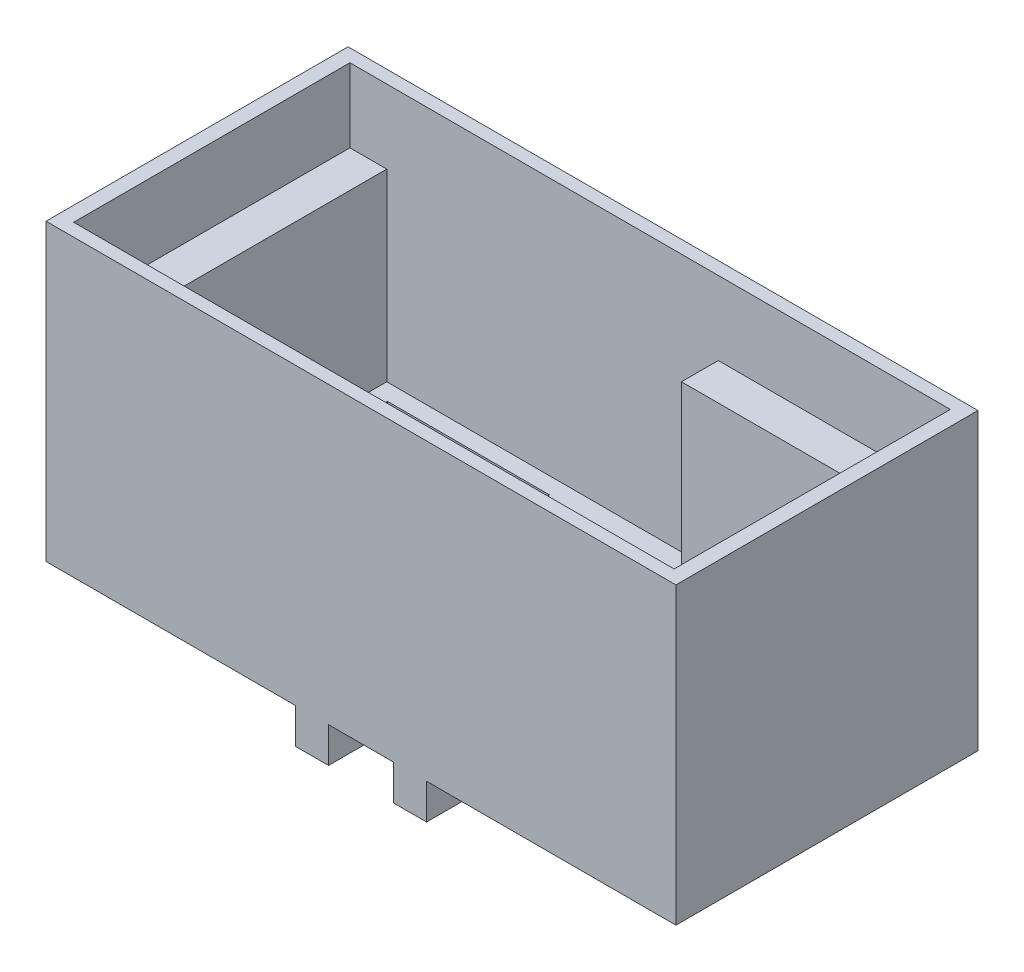
ISO-10303-21;
HEADER;
FILE_DESCRIPTION(('STEP AP214'),'2;1');
FILE_NAME('part.step','',(''),(''),'','','');
FILE_SCHEMA(('AUTOMOTIVE_DESIGN { 1 0 10303 214 1 1 1 1 }'));
ENDSEC;
DATA;
#1=APPLICATION_CONTEXT('core data for automotive mechanical design processes');
#2=APPLICATION_PROTOCOL_DEFINITION('international standard','automotive_design',2000,#1);
#3=PRODUCT_CONTEXT('',#1,'mechanical');
#4=PRODUCT('Part','Part','',(#3));
#5=PRODUCT_RELATED_PRODUCT_CATEGORY('part','',(#4));
#6=PRODUCT_DEFINITION_FORMATION('','',#4);
#7=PRODUCT_DEFINITION_CONTEXT('part definition',#1,'design');
#8=PRODUCT_DEFINITION('design','',#6,#7);
#9=PRODUCT_DEFINITION_SHAPE('','',#8);
#10=(LENGTH_UNIT() NAMED_UNIT(*) SI_UNIT(.MILLI.,.METRE.));
#11=(NAMED_UNIT(*) PLANE_ANGLE_UNIT() SI_UNIT($,.RADIAN.));
#12=(NAMED_UNIT(*) SI_UNIT($,.STERADIAN.) SOLID_ANGLE_UNIT());
#13=UNCERTAINTY_MEASURE_WITH_UNIT(LENGTH_MEASURE(1.E-05),#10,'distance_accuracy_value','');
#14=(GEOMETRIC_REPRESENTATION_CONTEXT(3) GLOBAL_UNCERTAINTY_ASSIGNED_CONTEXT((#13)) GLOBAL_UNIT_ASSIGNED_CONTEXT((#10,
#11,#12)) REPRESENTATION_CONTEXT('',''));
#15=CARTESIAN_POINT('',(0.,0.,0.));
#16=DIRECTION('',(0.,0.,1.));
#17=DIRECTION('',(1.,0.,0.));
#18=AXIS2_PLACEMENT_3D('',#15,#16,#17);
#19=CARTESIAN_POINT('',(0.,30.,0.));
#20=DIRECTION('',(0.,-1.,0.));
#21=DIRECTION('',(0.,0.,-1.));
#22=AXIS2_PLACEMENT_3D('',#19,#20,#21);
#23=PLANE('',#22);
#24=DIRECTION('',(0.,0.,-1.));
#25=VECTOR('',#24,1.);
#26=CARTESIAN_POINT('',(9.25,30.,-18.75));
#27=LINE('',#26,#25);
#28=CARTESIAN_POINT('',(9.25,30.,-13.75));
#29=VERTEX_POINT('',#28);
#30=CARTESIAN_POINT('',(9.25,30.,-18.75));
#31=VERTEX_POINT('',#30);
#32=EDGE_CURVE('E333',#29,#31,#27,.T.);
#33=ORIENTED_EDGE('',*,*,#32,.F.);
#34=DIRECTION('',(-1.,0.,0.));
#35=VECTOR('',#34,1.);
#36=CARTESIAN_POINT('',(-35.75,30.,-13.75));
#37=LINE('',#36,#35);
#38=CARTESIAN_POINT('',(35.75,30.,-13.75));
#39=VERTEX_POINT('',#38);
#40=EDGE_CURVE('E319',#39,#29,#37,.T.);
#41=ORIENTED_EDGE('',*,*,#40,.F.);
#42=DIRECTION('',(0.,0.,-1.));
#43=VECTOR('',#42,1.);
#44=CARTESIAN_POINT('',(35.75,30.,18.75));
#45=LINE('',#44,#43);
#46=CARTESIAN_POINT('',(35.75,30.,18.75));
#47=VERTEX_POINT('',#46);
#48=EDGE_CURVE('E342',#47,#39,#45,.T.);
#49=ORIENTED_EDGE('',*,*,#48,.F.);
#50=DIRECTION('',(1.,0.,0.));
#51=VECTOR('',#50,1.);
#52=CARTESIAN_POINT('',(-40.75,30.,18.75));
#53=LINE('',#52,#51);
#54=CARTESIAN_POINT('',(40.75,30.,18.75));
#55=VERTEX_POINT('',#54);
#56=EDGE_CURVE('E381',#47,#55,#53,.T.);
#57=ORIENTED_EDGE('',*,*,#56,.T.);
#58=DIRECTION('',(0.,0.,-1.));
#59=VECTOR('',#58,1.);
#60=CARTESIAN_POINT('',(40.75,30.,18.75));
#61=LINE('',#60,#59);
#62=CARTESIAN_POINT('',(40.75,30.,-18.75));
#63=VERTEX_POINT('',#62);
#64=EDGE_CURVE('E370',#55,#63,#61,.T.);
#65=ORIENTED_EDGE('',*,*,#64,.T.);
#66=DIRECTION('',(-1.,0.,0.));
#67=VECTOR('',#66,1.);
#68=CARTESIAN_POINT('',(-40.75,30.,-18.75));
#69=LINE('',#68,#67);
#70=EDGE_CURVE('E375',#63,#31,#69,.T.);
#71=ORIENTED_EDGE('',*,*,#70,.T.);
#72=EDGE_LOOP('',(#33,#41,#49,#57,#65,#71));
#73=FACE_BOUND('',#72,.T.);
#74=ADVANCED_FACE('F37',(#73),#23,.F.);
#75=DIRECTION('',(1.,0.,0.));
#76=VECTOR('',#75,1.);
#77=CARTESIAN_POINT('',(-35.75,30.,13.75));
#78=LINE('',#77,#76);
#79=CARTESIAN_POINT('',(-35.75,30.,13.75));
#80=VERTEX_POINT('',#79);
#81=CARTESIAN_POINT('',(-9.24999999999999,30.,13.75));
#82=VERTEX_POINT('',#81);
#83=EDGE_CURVE('E253',#80,#82,#78,.T.);
#84=ORIENTED_EDGE('',*,*,#83,.F.);
#85=DIRECTION('',(0.,0.,1.));
#86=VECTOR('',#85,1.);
#87=CARTESIAN_POINT('',(-35.75,30.,-18.75));
#88=LINE('',#87,#86);
#89=CARTESIAN_POINT('',(-35.75,30.,-18.75));
#90=VERTEX_POINT('',#89);
#91=EDGE_CURVE('E340',#90,#80,#88,.T.);
#92=ORIENTED_EDGE('',*,*,#91,.F.);
#93=CARTESIAN_POINT('',(-40.75,30.,-18.75));
#94=VERTEX_POINT('',#93);
#95=EDGE_CURVE('E373',#90,#94,#69,.T.);
#96=ORIENTED_EDGE('',*,*,#95,.T.);
#97=DIRECTION('',(0.,0.,1.));
#98=VECTOR('',#97,1.);
#99=CARTESIAN_POINT('',(-40.75,30.,18.75));
#100=LINE('',#99,#98);
#101=CARTESIAN_POINT('',(-40.75,30.,18.75));
#102=VERTEX_POINT('',#101);
#103=EDGE_CURVE('E378',#94,#102,#100,.T.);
#104=ORIENTED_EDGE('',*,*,#103,.T.);
#105=CARTESIAN_POINT('',(-9.24999999999999,30.,18.75));
#106=VERTEX_POINT('',#105);
#107=EDGE_CURVE('E382',#102,#106,#53,.T.);
#108=ORIENTED_EDGE('',*,*,#107,.T.);
#109=DIRECTION('',(0.,0.,1.));
#110=VECTOR('',#109,1.);
#111=CARTESIAN_POINT('',(-9.24999999999999,30.,18.75));
#112=LINE('',#111,#110);
#113=EDGE_CURVE('E359',#82,#106,#112,.T.);
#114=ORIENTED_EDGE('',*,*,#113,.F.);
#115=EDGE_LOOP('',(#84,#92,#96,#104,#108,#114));
#116=FACE_BOUND('',#115,.T.);
#117=ADVANCED_FACE('F541',(#116),#23,.F.);
#118=CARTESIAN_POINT('',(0.,0.,0.));
#119=DIRECTION('',(0.,-1.,0.));
#120=DIRECTION('',(0.,0.,-1.));
#121=AXIS2_PLACEMENT_3D('',#118,#119,#120);
#122=PLANE('',#121);
#123=DIRECTION('',(-1.,0.,0.));
#124=VECTOR('',#123,1.);
#125=CARTESIAN_POINT('',(-42.75,0.,-20.5));
#126=LINE('',#125,#124);
#127=CARTESIAN_POINT('',(4.39999999999999,0.,-20.5));
#128=VERTEX_POINT('',#127);
#129=CARTESIAN_POINT('',(-4.40000000000002,0.,-20.5));
#130=VERTEX_POINT('',#129);
#131=EDGE_CURVE('E472',#128,#130,#126,.T.);
#132=ORIENTED_EDGE('',*,*,#131,.F.);
#133=DIRECTION('',(0.,0.,-1.));
#134=VECTOR('',#133,1.);
#135=CARTESIAN_POINT('',(4.39999999999999,0.,20.5));
#136=LINE('',#135,#134);
#137=CARTESIAN_POINT('',(4.39999999999999,0.,20.5));
#138=VERTEX_POINT('',#137);
#139=EDGE_CURVE('E415',#138,#128,#136,.T.);
#140=ORIENTED_EDGE('',*,*,#139,.F.);
#141=DIRECTION('',(1.,0.,0.));
#142=VECTOR('',#141,1.);
#143=CARTESIAN_POINT('',(-42.75,0.,20.5));
#144=LINE('',#143,#142);
#145=CARTESIAN_POINT('',(-4.40000000000002,0.,20.5));
#146=VERTEX_POINT('',#145);
#147=EDGE_CURVE('E477',#146,#138,#144,.T.);
#148=ORIENTED_EDGE('',*,*,#147,.F.);
#149=DIRECTION('',(0.,0.,1.));
#150=VECTOR('',#149,1.);
#151=CARTESIAN_POINT('',(-4.40000000000001,0.,20.5));
#152=LINE('',#151,#150);
#153=EDGE_CURVE('E419',#130,#146,#152,.T.);
#154=ORIENTED_EDGE('',*,*,#153,.F.);
#155=EDGE_LOOP('',(#132,#140,#148,#154));
#156=FACE_BOUND('',#155,.T.);
#157=ADVANCED_FACE('F512',(#156),#122,.T.);
#158=DIRECTION('',(0.,0.,-1.));
#159=VECTOR('',#158,1.);
#160=CARTESIAN_POINT('',(33.4125,0.,16.5));
#161=LINE('',#160,#159);
#162=CARTESIAN_POINT('',(33.4125,0.,16.5));
#163=VERTEX_POINT('',#162);
#164=CARTESIAN_POINT('',(33.4125,0.,-11.5));
#165=VERTEX_POINT('',#164);
#166=EDGE_CURVE('E306',#163,#165,#161,.T.);
#167=ORIENTED_EDGE('',*,*,#166,.T.);
#168=DIRECTION('',(-1.,0.,0.));
#169=VECTOR('',#168,1.);
#170=CARTESIAN_POINT('',(11.4125,0.,-11.5));
#171=LINE('',#170,#169);
#172=CARTESIAN_POINT('',(11.4125,0.,-11.5));
#173=VERTEX_POINT('',#172);
#174=EDGE_CURVE('E285',#165,#173,#171,.T.);
#175=ORIENTED_EDGE('',*,*,#174,.T.);
#176=DIRECTION('',(0.,0.,1.));
#177=VECTOR('',#176,1.);
#178=CARTESIAN_POINT('',(11.4125,0.,16.5));
#179=LINE('',#178,#177);
#180=CARTESIAN_POINT('',(11.4125,0.,16.5));
#181=VERTEX_POINT('',#180);
#182=EDGE_CURVE('E312',#173,#181,#179,.T.);
#183=ORIENTED_EDGE('',*,*,#182,.T.);
#184=DIRECTION('',(1.,0.,0.));
#185=VECTOR('',#184,1.);
#186=CARTESIAN_POINT('',(11.4125,0.,16.5));
#187=LINE('',#186,#185);
#188=EDGE_CURVE('E309',#181,#163,#187,.T.);
#189=ORIENTED_EDGE('',*,*,#188,.T.);
#190=EDGE_LOOP('',(#167,#175,#183,#189));
#191=FACE_BOUND('',#190,.T.);
#192=CARTESIAN_POINT('',(8.89999999999998,0.,20.5));
#193=VERTEX_POINT('',#192);
#194=CARTESIAN_POINT('',(42.75,0.,20.5));
#195=VERTEX_POINT('',#194);
#196=EDGE_CURVE('E474',#193,#195,#144,.T.);
#197=ORIENTED_EDGE('',*,*,#196,.F.);
#198=DIRECTION('',(0.,0.,1.));
#199=VECTOR('',#198,1.);
#200=CARTESIAN_POINT('',(8.9,0.,20.5));
#201=LINE('',#200,#199);
#202=CARTESIAN_POINT('',(8.9,0.,-20.5));
#203=VERTEX_POINT('',#202);
#204=EDGE_CURVE('E412',#203,#193,#201,.T.);
#205=ORIENTED_EDGE('',*,*,#204,.F.);
#206=CARTESIAN_POINT('',(42.75,0.,-20.5));
#207=VERTEX_POINT('',#206);
#208=EDGE_CURVE('E468',#207,#203,#126,.T.);
#209=ORIENTED_EDGE('',*,*,#208,.F.);
#210=DIRECTION('',(0.,0.,-1.));
#211=VECTOR('',#210,1.);
#212=CARTESIAN_POINT('',(42.75,0.,20.5));
#213=LINE('',#212,#211);
#214=EDGE_CURVE('E453',#195,#207,#213,.T.);
#215=ORIENTED_EDGE('',*,*,#214,.F.);
#216=EDGE_LOOP('',(#197,#205,#209,#215));
#217=FACE_BOUND('',#216,.T.);
#218=ADVANCED_FACE('F524',(#191,#217),#122,.T.);
#219=CARTESIAN_POINT('',(42.75,40.,20.5));
#220=DIRECTION('',(-1.,0.,0.));
#221=DIRECTION('',(0.,0.,1.));
#222=AXIS2_PLACEMENT_3D('',#219,#220,#221);
#223=PLANE('',#222);
#224=ORIENTED_EDGE('',*,*,#214,.T.);
#225=DIRECTION('',(0.,-1.,0.));
#226=VECTOR('',#225,1.);
#227=CARTESIAN_POINT('',(42.75,40.,-20.5));
#228=LINE('',#227,#226);
#229=CARTESIAN_POINT('',(42.75,40.,-20.5));
#230=VERTEX_POINT('',#229);
#231=EDGE_CURVE('E11',#230,#207,#228,.T.);
#232=ORIENTED_EDGE('',*,*,#231,.F.);
#233=DIRECTION('',(0.,0.,-1.));
#234=VECTOR('',#233,1.);
#235=CARTESIAN_POINT('',(42.75,40.,20.5));
#236=LINE('',#235,#234);
#237=CARTESIAN_POINT('',(42.75,40.,20.5));
#238=VERTEX_POINT('',#237);
#239=EDGE_CURVE('E454',#238,#230,#236,.T.);
#240=ORIENTED_EDGE('',*,*,#239,.F.);
#241=DIRECTION('',(0.,-1.,0.));
#242=VECTOR('',#241,1.);
#243=CARTESIAN_POINT('',(42.75,40.,20.5));
#244=LINE('',#243,#242);
#245=EDGE_CURVE('E464',#238,#195,#244,.T.);
#246=ORIENTED_EDGE('',*,*,#245,.T.);
#247=EDGE_LOOP('',(#224,#232,#240,#246));
#248=FACE_BOUND('',#247,.T.);
#249=ADVANCED_FACE('F39',(#248),#223,.F.);
#250=CARTESIAN_POINT('',(-42.75,40.,-20.5));
#251=DIRECTION('',(0.,0.,1.));
#252=DIRECTION('',(1.,0.,0.));
#253=AXIS2_PLACEMENT_3D('',#250,#251,#252);
#254=PLANE('',#253);
#255=ORIENTED_EDGE('',*,*,#208,.T.);
#256=DIRECTION('',(0.,1.,0.));
#257=VECTOR('',#256,1.);
#258=CARTESIAN_POINT('',(8.9,-4.8,-20.5));
#259=LINE('',#258,#257);
#260=CARTESIAN_POINT('',(8.9,-4.8,-20.5));
#261=VERTEX_POINT('',#260);
#262=EDGE_CURVE('E405',#261,#203,#259,.T.);
#263=ORIENTED_EDGE('',*,*,#262,.F.);
#264=DIRECTION('',(1.,0.,0.));
#265=VECTOR('',#264,1.);
#266=CARTESIAN_POINT('',(4.39999999999999,-4.8,-20.5));
#267=LINE('',#266,#265);
#268=CARTESIAN_POINT('',(4.39999999999999,-4.8,-20.5));
#269=VERTEX_POINT('',#268);
#270=EDGE_CURVE('E423',#269,#261,#267,.T.);
#271=ORIENTED_EDGE('',*,*,#270,.F.);
#272=DIRECTION('',(0.,1.,0.));
#273=VECTOR('',#272,1.);
#274=CARTESIAN_POINT('',(4.39999999999999,-4.8,-20.5));
#275=LINE('',#274,#273);
#276=EDGE_CURVE('E397',#269,#128,#275,.T.);
#277=ORIENTED_EDGE('',*,*,#276,.T.);
#278=ORIENTED_EDGE('',*,*,#131,.T.);
#279=DIRECTION('',(0.,1.,0.));
#280=VECTOR('',#279,1.);
#281=CARTESIAN_POINT('',(-4.40000000000001,-4.8,-20.5));
#282=LINE('',#281,#280);
#283=CARTESIAN_POINT('',(-4.40000000000001,-4.8,-20.5));
#284=VERTEX_POINT('',#283);
#285=EDGE_CURVE('E437',#284,#130,#282,.T.);
#286=ORIENTED_EDGE('',*,*,#285,.F.);
#287=DIRECTION('',(1.,0.,0.));
#288=VECTOR('',#287,1.);
#289=CARTESIAN_POINT('',(-4.40000000000001,-4.8,-20.5));
#290=LINE('',#289,#288);
#291=CARTESIAN_POINT('',(-8.9,-4.8,-20.5));
#292=VERTEX_POINT('',#291);
#293=EDGE_CURVE('E435',#292,#284,#290,.T.);
#294=ORIENTED_EDGE('',*,*,#293,.F.);
#295=DIRECTION('',(0.,1.,0.));
#296=VECTOR('',#295,1.);
#297=CARTESIAN_POINT('',(-8.9,-4.8,-20.5));
#298=LINE('',#297,#296);
#299=CARTESIAN_POINT('',(-8.9,0.,-20.5));
#300=VERTEX_POINT('',#299);
#301=EDGE_CURVE('E444',#292,#300,#298,.T.);
#302=ORIENTED_EDGE('',*,*,#301,.T.);
#303=CARTESIAN_POINT('',(-42.75,0.,-20.5));
#304=VERTEX_POINT('',#303);
#305=EDGE_CURVE('E467',#300,#304,#126,.T.);
#306=ORIENTED_EDGE('',*,*,#305,.T.);
#307=DIRECTION('',(0.,-1.,0.));
#308=VECTOR('',#307,1.);
#309=CARTESIAN_POINT('',(-42.75,40.,-20.5));
#310=LINE('',#309,#308);
#311=CARTESIAN_POINT('',(-42.75,40.,-20.5));
#312=VERTEX_POINT('',#311);
#313=EDGE_CURVE('E45',#312,#304,#310,.T.);
#314=ORIENTED_EDGE('',*,*,#313,.F.);
#315=DIRECTION('',(-1.,0.,0.));
#316=VECTOR('',#315,1.);
#317=CARTESIAN_POINT('',(-42.75,40.,-20.5));
#318=LINE('',#317,#316);
#319=EDGE_CURVE('E457',#230,#312,#318,.T.);
#320=ORIENTED_EDGE('',*,*,#319,.F.);
#321=ORIENTED_EDGE('',*,*,#231,.T.);
#322=EDGE_LOOP('',(#255,#263,#271,#277,#278,#286,#294,#302,#306,#314,#320,#321));
#323=FACE_BOUND('',#322,.T.);
#324=ADVANCED_FACE('F526',(#323),#254,.F.);
#325=CARTESIAN_POINT('',(-42.75,40.,20.5));
#326=DIRECTION('',(1.,0.,0.));
#327=DIRECTION('',(0.,0.,-1.));
#328=AXIS2_PLACEMENT_3D('',#325,#326,#327);
#329=PLANE('',#328);
#330=DIRECTION('',(0.,0.,1.));
#331=VECTOR('',#330,1.);
#332=CARTESIAN_POINT('',(-42.75,0.,20.5));
#333=LINE('',#332,#331);
#334=CARTESIAN_POINT('',(-42.75,0.,20.5));
#335=VERTEX_POINT('',#334);
#336=EDGE_CURVE('E471',#304,#335,#333,.T.);
#337=ORIENTED_EDGE('',*,*,#336,.T.);
#338=DIRECTION('',(0.,-1.,0.));
#339=VECTOR('',#338,1.);
#340=CARTESIAN_POINT('',(-42.75,40.,20.5));
#341=LINE('',#340,#339);
#342=CARTESIAN_POINT('',(-42.75,40.,20.5));
#343=VERTEX_POINT('',#342);
#344=EDGE_CURVE('E480',#343,#335,#341,.T.);
#345=ORIENTED_EDGE('',*,*,#344,.F.);
#346=DIRECTION('',(0.,0.,1.));
#347=VECTOR('',#346,1.);
#348=CARTESIAN_POINT('',(-42.75,40.,20.5));
#349=LINE('',#348,#347);
#350=EDGE_CURVE('E460',#312,#343,#349,.T.);
#351=ORIENTED_EDGE('',*,*,#350,.F.);
#352=ORIENTED_EDGE('',*,*,#313,.T.);
#353=EDGE_LOOP('',(#337,#345,#351,#352));
#354=FACE_BOUND('',#353,.T.);
#355=ADVANCED_FACE('F487',(#354),#329,.F.);
#356=CARTESIAN_POINT('',(-42.75,40.,20.5));
#357=DIRECTION('',(0.,0.,-1.));
#358=DIRECTION('',(-1.,0.,0.));
#359=AXIS2_PLACEMENT_3D('',#356,#357,#358);
#360=PLANE('',#359);
#361=CARTESIAN_POINT('',(-8.90000000000002,0.,20.5));
#362=VERTEX_POINT('',#361);
#363=EDGE_CURVE('E458',#335,#362,#144,.T.);
#364=ORIENTED_EDGE('',*,*,#363,.T.);
#365=DIRECTION('',(0.,1.,0.));
#366=VECTOR('',#365,1.);
#367=CARTESIAN_POINT('',(-8.9,-4.8,20.5));
#368=LINE('',#367,#366);
#369=CARTESIAN_POINT('',(-8.9,-4.8,20.5));
#370=VERTEX_POINT('',#369);
#371=EDGE_CURVE('E447',#370,#362,#368,.T.);
#372=ORIENTED_EDGE('',*,*,#371,.F.);
#373=DIRECTION('',(-1.,0.,0.));
#374=VECTOR('',#373,1.);
#375=CARTESIAN_POINT('',(-4.40000000000001,-4.8,20.5));
#376=LINE('',#375,#374);
#377=CARTESIAN_POINT('',(-4.40000000000001,-4.8,20.5));
#378=VERTEX_POINT('',#377);
#379=EDGE_CURVE('E430',#378,#370,#376,.T.);
#380=ORIENTED_EDGE('',*,*,#379,.F.);
#381=DIRECTION('',(0.,1.,0.));
#382=VECTOR('',#381,1.);
#383=CARTESIAN_POINT('',(-4.40000000000001,-4.8,20.5));
#384=LINE('',#383,#382);
#385=EDGE_CURVE('E450',#378,#146,#384,.T.);
#386=ORIENTED_EDGE('',*,*,#385,.T.);
#387=ORIENTED_EDGE('',*,*,#147,.T.);
#388=DIRECTION('',(0.,1.,0.));
#389=VECTOR('',#388,1.);
#390=CARTESIAN_POINT('',(4.39999999999999,-4.8,20.5));
#391=LINE('',#390,#389);
#392=CARTESIAN_POINT('',(4.39999999999999,-4.8,20.5));
#393=VERTEX_POINT('',#392);
#394=EDGE_CURVE('E409',#393,#138,#391,.T.);
#395=ORIENTED_EDGE('',*,*,#394,.F.);
#396=DIRECTION('',(-1.,0.,0.));
#397=VECTOR('',#396,1.);
#398=CARTESIAN_POINT('',(4.39999999999999,-4.8,20.5));
#399=LINE('',#398,#397);
#400=CARTESIAN_POINT('',(8.9,-4.8,20.5));
#401=VERTEX_POINT('',#400);
#402=EDGE_CURVE('E411',#401,#393,#399,.T.);
#403=ORIENTED_EDGE('',*,*,#402,.F.);
#404=DIRECTION('',(0.,1.,0.));
#405=VECTOR('',#404,1.);
#406=CARTESIAN_POINT('',(8.9,-4.8,20.5));
#407=LINE('',#406,#405);
#408=EDGE_CURVE('E407',#401,#193,#407,.T.);
#409=ORIENTED_EDGE('',*,*,#408,.T.);
#410=ORIENTED_EDGE('',*,*,#196,.T.);
#411=ORIENTED_EDGE('',*,*,#245,.F.);
#412=DIRECTION('',(1.,0.,0.));
#413=VECTOR('',#412,1.);
#414=CARTESIAN_POINT('',(-42.75,40.,20.5));
#415=LINE('',#414,#413);
#416=EDGE_CURVE('E462',#343,#238,#415,.T.);
#417=ORIENTED_EDGE('',*,*,#416,.F.);
#418=ORIENTED_EDGE('',*,*,#344,.T.);
#419=EDGE_LOOP('',(#364,#372,#380,#386,#387,#395,#403,#409,#410,#411,#417,#418));
#420=FACE_BOUND('',#419,.T.);
#421=ADVANCED_FACE('F493',(#420),#360,.F.);
#422=CARTESIAN_POINT('',(0.,40.,0.));
#423=DIRECTION('',(0.,-1.,0.));
#424=DIRECTION('',(0.,0.,-1.));
#425=AXIS2_PLACEMENT_3D('',#422,#423,#424);
#426=PLANE('',#425);
#427=DIRECTION('',(-1.,0.,0.));
#428=VECTOR('',#427,1.);
#429=CARTESIAN_POINT('',(-40.75,40.,-18.75));
#430=LINE('',#429,#428);
#431=CARTESIAN_POINT('',(40.75,40.,-18.75));
#432=VERTEX_POINT('',#431);
#433=CARTESIAN_POINT('',(-40.75,40.,-18.75));
#434=VERTEX_POINT('',#433);
#435=EDGE_CURVE('E387',#432,#434,#430,.T.);
#436=ORIENTED_EDGE('',*,*,#435,.F.);
#437=DIRECTION('',(0.,0.,-1.));
#438=VECTOR('',#437,1.);
#439=CARTESIAN_POINT('',(40.75,40.,18.75));
#440=LINE('',#439,#438);
#441=CARTESIAN_POINT('',(40.75,40.,18.75));
#442=VERTEX_POINT('',#441);
#443=EDGE_CURVE('E347',#442,#432,#440,.T.);
#444=ORIENTED_EDGE('',*,*,#443,.F.);
#445=DIRECTION('',(1.,0.,0.));
#446=VECTOR('',#445,1.);
#447=CARTESIAN_POINT('',(-40.75,40.,18.75));
#448=LINE('',#447,#446);
#449=CARTESIAN_POINT('',(-40.75,40.,18.75));
#450=VERTEX_POINT('',#449);
#451=EDGE_CURVE('E374',#450,#442,#448,.T.);
#452=ORIENTED_EDGE('',*,*,#451,.F.);
#453=DIRECTION('',(0.,0.,1.));
#454=VECTOR('',#453,1.);
#455=CARTESIAN_POINT('',(-40.75,40.,18.75));
#456=LINE('',#455,#454);
#457=EDGE_CURVE('E390',#434,#450,#456,.T.);
#458=ORIENTED_EDGE('',*,*,#457,.F.);
#459=EDGE_LOOP('',(#436,#444,#452,#458));
#460=FACE_BOUND('',#459,.T.);
#461=ORIENTED_EDGE('',*,*,#239,.T.);
#462=ORIENTED_EDGE('',*,*,#319,.T.);
#463=ORIENTED_EDGE('',*,*,#350,.T.);
#464=ORIENTED_EDGE('',*,*,#416,.T.);
#465=EDGE_LOOP('',(#461,#462,#463,#464));
#466=FACE_BOUND('',#465,.T.);
#467=ADVANCED_FACE('F528',(#460,#466),#426,.F.);
#468=DIRECTION('',(0.,0.,-1.));
#469=VECTOR('',#468,1.);
#470=CARTESIAN_POINT('',(-11.4065211780004,0.,11.5));
#471=LINE('',#470,#469);
#472=CARTESIAN_POINT('',(-11.4065211780004,0.,11.5));
#473=VERTEX_POINT('',#472);
#474=CARTESIAN_POINT('',(-11.4065211780004,0.,-16.5));
#475=VERTEX_POINT('',#474);
#476=EDGE_CURVE('E258',#473,#475,#471,.T.);
#477=ORIENTED_EDGE('',*,*,#476,.T.);
#478=DIRECTION('',(-1.,0.,0.));
#479=VECTOR('',#478,1.);
#480=CARTESIAN_POINT('',(-33.4065211780004,0.,-16.5));
#481=LINE('',#480,#479);
#482=CARTESIAN_POINT('',(-33.4065211780004,0.,-16.5));
#483=VERTEX_POINT('',#482);
#484=EDGE_CURVE('E245',#475,#483,#481,.T.);
#485=ORIENTED_EDGE('',*,*,#484,.T.);
#486=DIRECTION('',(0.,0.,1.));
#487=VECTOR('',#486,1.);
#488=CARTESIAN_POINT('',(-33.4065211780004,0.,11.5));
#489=LINE('',#488,#487);
#490=CARTESIAN_POINT('',(-33.4065211780004,0.,11.5));
#491=VERTEX_POINT('',#490);
#492=EDGE_CURVE('E271',#483,#491,#489,.T.);
#493=ORIENTED_EDGE('',*,*,#492,.T.);
#494=DIRECTION('',(1.,0.,0.));
#495=VECTOR('',#494,1.);
#496=CARTESIAN_POINT('',(-33.4065211780004,0.,11.5));
#497=LINE('',#496,#495);
#498=EDGE_CURVE('E267',#491,#473,#497,.T.);
#499=ORIENTED_EDGE('',*,*,#498,.T.);
#500=EDGE_LOOP('',(#477,#485,#493,#499));
#501=FACE_BOUND('',#500,.T.);
#502=DIRECTION('',(0.,0.,-1.));
#503=VECTOR('',#502,1.);
#504=CARTESIAN_POINT('',(-8.9,0.,20.5));
#505=LINE('',#504,#503);
#506=EDGE_CURVE('E431',#362,#300,#505,.T.);
#507=ORIENTED_EDGE('',*,*,#506,.F.);
#508=ORIENTED_EDGE('',*,*,#363,.F.);
#509=ORIENTED_EDGE('',*,*,#336,.F.);
#510=ORIENTED_EDGE('',*,*,#305,.F.);
#511=EDGE_LOOP('',(#507,#508,#509,#510));
#512=FACE_BOUND('',#511,.T.);
#513=ADVANCED_FACE('F265',(#501,#512),#122,.T.);
#514=CARTESIAN_POINT('',(-4.40000000000001,-4.8,20.5));
#515=DIRECTION('',(-1.,0.,0.));
#516=DIRECTION('',(0.,0.,1.));
#517=AXIS2_PLACEMENT_3D('',#514,#515,#516);
#518=PLANE('',#517);
#519=ORIENTED_EDGE('',*,*,#153,.T.);
#520=ORIENTED_EDGE('',*,*,#385,.F.);
#521=DIRECTION('',(0.,0.,1.));
#522=VECTOR('',#521,1.);
#523=CARTESIAN_POINT('',(-4.40000000000001,-4.8,20.5));
#524=LINE('',#523,#522);
#525=EDGE_CURVE('E427',#284,#378,#524,.T.);
#526=ORIENTED_EDGE('',*,*,#525,.F.);
#527=ORIENTED_EDGE('',*,*,#285,.T.);
#528=EDGE_LOOP('',(#519,#520,#526,#527));
#529=FACE_BOUND('',#528,.T.);
#530=ADVANCED_FACE('F509',(#529),#518,.F.);
#531=CARTESIAN_POINT('',(-8.9,-4.8,20.5));
#532=DIRECTION('',(1.,0.,0.));
#533=DIRECTION('',(0.,0.,-1.));
#534=AXIS2_PLACEMENT_3D('',#531,#532,#533);
#535=PLANE('',#534);
#536=ORIENTED_EDGE('',*,*,#506,.T.);
#537=ORIENTED_EDGE('',*,*,#301,.F.);
#538=DIRECTION('',(0.,0.,-1.));
#539=VECTOR('',#538,1.);
#540=CARTESIAN_POINT('',(-8.9,-4.8,20.5));
#541=LINE('',#540,#539);
#542=EDGE_CURVE('E433',#370,#292,#541,.T.);
#543=ORIENTED_EDGE('',*,*,#542,.F.);
#544=ORIENTED_EDGE('',*,*,#371,.T.);
#545=EDGE_LOOP('',(#536,#537,#543,#544));
#546=FACE_BOUND('',#545,.T.);
#547=ADVANCED_FACE('F497',(#546),#535,.F.);
#548=CARTESIAN_POINT('',(0.,-4.8,0.));
#549=DIRECTION('',(0.,1.,0.));
#550=DIRECTION('',(0.,0.,1.));
#551=AXIS2_PLACEMENT_3D('',#548,#549,#550);
#552=PLANE('',#551);
#553=ORIENTED_EDGE('',*,*,#525,.T.);
#554=ORIENTED_EDGE('',*,*,#379,.T.);
#555=ORIENTED_EDGE('',*,*,#542,.T.);
#556=ORIENTED_EDGE('',*,*,#293,.T.);
#557=EDGE_LOOP('',(#553,#554,#555,#556));
#558=FACE_BOUND('',#557,.T.);
#559=ADVANCED_FACE('F501',(#558),#552,.F.);
#560=CARTESIAN_POINT('',(4.39999999999999,-4.8,20.5));
#561=DIRECTION('',(1.,0.,0.));
#562=DIRECTION('',(0.,0.,-1.));
#563=AXIS2_PLACEMENT_3D('',#560,#561,#562);
#564=PLANE('',#563);
#565=ORIENTED_EDGE('',*,*,#139,.T.);
#566=ORIENTED_EDGE('',*,*,#276,.F.);
#567=DIRECTION('',(0.,0.,-1.));
#568=VECTOR('',#567,1.);
#569=CARTESIAN_POINT('',(4.39999999999999,-4.8,20.5));
#570=LINE('',#569,#568);
#571=EDGE_CURVE('E416',#393,#269,#570,.T.);
#572=ORIENTED_EDGE('',*,*,#571,.F.);
#573=ORIENTED_EDGE('',*,*,#394,.T.);
#574=EDGE_LOOP('',(#565,#566,#572,#573));
#575=FACE_BOUND('',#574,.T.);
#576=ADVANCED_FACE('F571',(#575),#564,.F.);
#577=CARTESIAN_POINT('',(8.9,-4.8,20.5));
#578=DIRECTION('',(-1.,0.,0.));
#579=DIRECTION('',(0.,0.,1.));
#580=AXIS2_PLACEMENT_3D('',#577,#578,#579);
#581=PLANE('',#580);
#582=ORIENTED_EDGE('',*,*,#204,.T.);
#583=ORIENTED_EDGE('',*,*,#408,.F.);
#584=DIRECTION('',(0.,0.,1.));
#585=VECTOR('',#584,1.);
#586=CARTESIAN_POINT('',(8.9,-4.8,20.5));
#587=LINE('',#586,#585);
#588=EDGE_CURVE('E421',#261,#401,#587,.T.);
#589=ORIENTED_EDGE('',*,*,#588,.F.);
#590=ORIENTED_EDGE('',*,*,#262,.T.);
#591=EDGE_LOOP('',(#582,#583,#589,#590));
#592=FACE_BOUND('',#591,.T.);
#593=ADVANCED_FACE('F574',(#592),#581,.F.);
#594=CARTESIAN_POINT('',(0.,-4.8,0.));
#595=DIRECTION('',(0.,-1.,0.));
#596=DIRECTION('',(0.,0.,-1.));
#597=AXIS2_PLACEMENT_3D('',#594,#595,#596);
#598=PLANE('',#597);
#599=ORIENTED_EDGE('',*,*,#571,.T.);
#600=ORIENTED_EDGE('',*,*,#270,.T.);
#601=ORIENTED_EDGE('',*,*,#588,.T.);
#602=ORIENTED_EDGE('',*,*,#402,.T.);
#603=EDGE_LOOP('',(#599,#600,#601,#602));
#604=FACE_BOUND('',#603,.T.);
#605=ADVANCED_FACE('F569',(#604),#598,.T.);
#606=CARTESIAN_POINT('',(40.75,30.,18.75));
#607=DIRECTION('',(1.,0.,0.));
#608=DIRECTION('',(0.,0.,-1.));
#609=AXIS2_PLACEMENT_3D('',#606,#607,#608);
#610=PLANE('',#609);
#611=ORIENTED_EDGE('',*,*,#443,.T.);
#612=DIRECTION('',(0.,1.,0.));
#613=VECTOR('',#612,1.);
#614=CARTESIAN_POINT('',(40.75,30.,-18.75));
#615=LINE('',#614,#613);
#616=EDGE_CURVE('E385',#63,#432,#615,.T.);
#617=ORIENTED_EDGE('',*,*,#616,.F.);
#618=ORIENTED_EDGE('',*,*,#64,.F.);
#619=DIRECTION('',(0.,1.,0.));
#620=VECTOR('',#619,1.);
#621=CARTESIAN_POINT('',(40.75,30.,18.75));
#622=LINE('',#621,#620);
#623=EDGE_CURVE('E395',#55,#442,#622,.T.);
#624=ORIENTED_EDGE('',*,*,#623,.T.);
#625=EDGE_LOOP('',(#611,#617,#618,#624));
#626=FACE_BOUND('',#625,.T.);
#627=ADVANCED_FACE('F557',(#626),#610,.F.);
#628=CARTESIAN_POINT('',(-40.75,30.,18.75));
#629=DIRECTION('',(0.,0.,1.));
#630=DIRECTION('',(1.,0.,0.));
#631=AXIS2_PLACEMENT_3D('',#628,#629,#630);
#632=PLANE('',#631);
#633=ORIENTED_EDGE('',*,*,#451,.T.);
#634=ORIENTED_EDGE('',*,*,#623,.F.);
#635=ORIENTED_EDGE('',*,*,#56,.F.);
#636=DIRECTION('',(0.,1.,0.));
#637=VECTOR('',#636,1.);
#638=CARTESIAN_POINT('',(35.75,5.,18.75));
#639=LINE('',#638,#637);
#640=CARTESIAN_POINT('',(35.75,5.,18.75));
#641=VERTEX_POINT('',#640);
#642=EDGE_CURVE('E327',#641,#47,#639,.T.);
#643=ORIENTED_EDGE('',*,*,#642,.F.);
#644=DIRECTION('',(1.,0.,0.));
#645=VECTOR('',#644,1.);
#646=CARTESIAN_POINT('',(35.75,5.,18.75));
#647=LINE('',#646,#645);
#648=CARTESIAN_POINT('',(-9.24999999999999,5.,18.75));
#649=VERTEX_POINT('',#648);
#650=EDGE_CURVE('E355',#649,#641,#647,.T.);
#651=ORIENTED_EDGE('',*,*,#650,.F.);
#652=DIRECTION('',(0.,1.,0.));
#653=VECTOR('',#652,1.);
#654=CARTESIAN_POINT('',(-9.24999999999999,5.,18.75));
#655=LINE('',#654,#653);
#656=EDGE_CURVE('E356',#649,#106,#655,.T.);
#657=ORIENTED_EDGE('',*,*,#656,.T.);
#658=ORIENTED_EDGE('',*,*,#107,.F.);
#659=DIRECTION('',(0.,1.,0.));
#660=VECTOR('',#659,1.);
#661=CARTESIAN_POINT('',(-40.75,30.,18.75));
#662=LINE('',#661,#660);
#663=EDGE_CURVE('E398',#102,#450,#662,.T.);
#664=ORIENTED_EDGE('',*,*,#663,.T.);
#665=EDGE_LOOP('',(#633,#634,#635,#643,#651,#657,#658,#664));
#666=FACE_BOUND('',#665,.T.);
#667=ADVANCED_FACE('F553',(#666),#632,.F.);
#668=CARTESIAN_POINT('',(-40.75,30.,18.75));
#669=DIRECTION('',(-1.,0.,0.));
#670=DIRECTION('',(0.,0.,1.));
#671=AXIS2_PLACEMENT_3D('',#668,#669,#670);
#672=PLANE('',#671);
#673=ORIENTED_EDGE('',*,*,#457,.T.);
#674=ORIENTED_EDGE('',*,*,#663,.F.);
#675=ORIENTED_EDGE('',*,*,#103,.F.);
#676=DIRECTION('',(0.,1.,0.));
#677=VECTOR('',#676,1.);
#678=CARTESIAN_POINT('',(-40.75,30.,-18.75));
#679=LINE('',#678,#677);
#680=EDGE_CURVE('E400',#94,#434,#679,.T.);
#681=ORIENTED_EDGE('',*,*,#680,.T.);
#682=EDGE_LOOP('',(#673,#674,#675,#681));
#683=FACE_BOUND('',#682,.T.);
#684=ADVANCED_FACE('F556',(#683),#672,.F.);
#685=CARTESIAN_POINT('',(-40.75,30.,-18.75));
#686=DIRECTION('',(0.,0.,-1.));
#687=DIRECTION('',(-1.,0.,0.));
#688=AXIS2_PLACEMENT_3D('',#685,#686,#687);
#689=PLANE('',#688);
#690=ORIENTED_EDGE('',*,*,#435,.T.);
#691=ORIENTED_EDGE('',*,*,#680,.F.);
#692=ORIENTED_EDGE('',*,*,#95,.F.);
#693=DIRECTION('',(0.,1.,0.));
#694=VECTOR('',#693,1.);
#695=CARTESIAN_POINT('',(-35.75,5.,-18.75));
#696=LINE('',#695,#694);
#697=CARTESIAN_POINT('',(-35.75,5.,-18.75));
#698=VERTEX_POINT('',#697);
#699=EDGE_CURVE('E345',#698,#90,#696,.T.);
#700=ORIENTED_EDGE('',*,*,#699,.F.);
#701=DIRECTION('',(-1.,0.,0.));
#702=VECTOR('',#701,1.);
#703=CARTESIAN_POINT('',(-35.75,5.,-18.75));
#704=LINE('',#703,#702);
#705=CARTESIAN_POINT('',(9.25,5.,-18.75));
#706=VERTEX_POINT('',#705);
#707=EDGE_CURVE('E336',#706,#698,#704,.T.);
#708=ORIENTED_EDGE('',*,*,#707,.F.);
#709=DIRECTION('',(0.,1.,0.));
#710=VECTOR('',#709,1.);
#711=CARTESIAN_POINT('',(9.25,5.,-18.75));
#712=LINE('',#711,#710);
#713=EDGE_CURVE('E348',#706,#31,#712,.T.);
#714=ORIENTED_EDGE('',*,*,#713,.T.);
#715=ORIENTED_EDGE('',*,*,#70,.F.);
#716=ORIENTED_EDGE('',*,*,#616,.T.);
#717=EDGE_LOOP('',(#690,#691,#692,#700,#708,#714,#715,#716));
#718=FACE_BOUND('',#717,.T.);
#719=ADVANCED_FACE('F561',(#718),#689,.F.);
#720=CARTESIAN_POINT('',(35.75,5.,18.75));
#721=DIRECTION('',(1.,0.,0.));
#722=DIRECTION('',(0.,0.,-1.));
#723=AXIS2_PLACEMENT_3D('',#720,#721,#722);
#724=PLANE('',#723);
#725=ORIENTED_EDGE('',*,*,#48,.T.);
#726=DIRECTION('',(0.,1.,0.));
#727=VECTOR('',#726,1.);
#728=CARTESIAN_POINT('',(35.75,5.,-13.75));
#729=LINE('',#728,#727);
#730=CARTESIAN_POINT('',(35.75,5.,-13.75));
#731=VERTEX_POINT('',#730);
#732=EDGE_CURVE('E324',#731,#39,#729,.T.);
#733=ORIENTED_EDGE('',*,*,#732,.F.);
#734=DIRECTION('',(0.,0.,-1.));
#735=VECTOR('',#734,1.);
#736=CARTESIAN_POINT('',(35.75,5.,18.75));
#737=LINE('',#736,#735);
#738=EDGE_CURVE('E362',#641,#731,#737,.T.);
#739=ORIENTED_EDGE('',*,*,#738,.F.);
#740=ORIENTED_EDGE('',*,*,#642,.T.);
#741=EDGE_LOOP('',(#725,#733,#739,#740));
#742=FACE_BOUND('',#741,.T.);
#743=ADVANCED_FACE('F565',(#742),#724,.F.);
#744=CARTESIAN_POINT('',(-9.24999999999999,5.,18.75));
#745=DIRECTION('',(-1.,0.,0.));
#746=DIRECTION('',(0.,0.,1.));
#747=AXIS2_PLACEMENT_3D('',#744,#745,#746);
#748=PLANE('',#747);
#749=ORIENTED_EDGE('',*,*,#113,.T.);
#750=ORIENTED_EDGE('',*,*,#656,.F.);
#751=DIRECTION('',(0.,0.,1.));
#752=VECTOR('',#751,1.);
#753=CARTESIAN_POINT('',(-9.24999999999999,5.,18.75));
#754=LINE('',#753,#752);
#755=CARTESIAN_POINT('',(-9.24999999999999,5.,13.75));
#756=VERTEX_POINT('',#755);
#757=EDGE_CURVE('E366',#756,#649,#754,.T.);
#758=ORIENTED_EDGE('',*,*,#757,.F.);
#759=DIRECTION('',(0.,1.,0.));
#760=VECTOR('',#759,1.);
#761=CARTESIAN_POINT('',(-9.24999999999999,5.,13.75));
#762=LINE('',#761,#760);
#763=EDGE_CURVE('E352',#756,#82,#762,.T.);
#764=ORIENTED_EDGE('',*,*,#763,.T.);
#765=EDGE_LOOP('',(#749,#750,#758,#764));
#766=FACE_BOUND('',#765,.T.);
#767=ADVANCED_FACE('F551',(#766),#748,.F.);
#768=CARTESIAN_POINT('',(-35.75,5.,-18.75));
#769=DIRECTION('',(-1.,0.,0.));
#770=DIRECTION('',(0.,0.,1.));
#771=AXIS2_PLACEMENT_3D('',#768,#769,#770);
#772=PLANE('',#771);
#773=ORIENTED_EDGE('',*,*,#91,.T.);
#774=DIRECTION('',(0.,1.,0.));
#775=VECTOR('',#774,1.);
#776=CARTESIAN_POINT('',(-35.75,5.,13.75));
#777=LINE('',#776,#775);
#778=CARTESIAN_POINT('',(-35.75,5.,13.75));
#779=VERTEX_POINT('',#778);
#780=EDGE_CURVE('E321',#779,#80,#777,.T.);
#781=ORIENTED_EDGE('',*,*,#780,.F.);
#782=DIRECTION('',(0.,0.,1.));
#783=VECTOR('',#782,1.);
#784=CARTESIAN_POINT('',(-35.75,5.,-18.75));
#785=LINE('',#784,#783);
#786=EDGE_CURVE('E330',#698,#779,#785,.T.);
#787=ORIENTED_EDGE('',*,*,#786,.F.);
#788=ORIENTED_EDGE('',*,*,#699,.T.);
#789=EDGE_LOOP('',(#773,#781,#787,#788));
#790=FACE_BOUND('',#789,.T.);
#791=ADVANCED_FACE('F640',(#790),#772,.F.);
#792=CARTESIAN_POINT('',(9.25,5.,-18.75));
#793=DIRECTION('',(1.,0.,0.));
#794=DIRECTION('',(0.,0.,-1.));
#795=AXIS2_PLACEMENT_3D('',#792,#793,#794);
#796=PLANE('',#795);
#797=ORIENTED_EDGE('',*,*,#32,.T.);
#798=ORIENTED_EDGE('',*,*,#713,.F.);
#799=DIRECTION('',(0.,0.,-1.));
#800=VECTOR('',#799,1.);
#801=CARTESIAN_POINT('',(9.25,5.,-18.75));
#802=LINE('',#801,#800);
#803=CARTESIAN_POINT('',(9.25,5.,-13.75));
#804=VERTEX_POINT('',#803);
#805=EDGE_CURVE('E332',#804,#706,#802,.T.);
#806=ORIENTED_EDGE('',*,*,#805,.F.);
#807=DIRECTION('',(0.,1.,0.));
#808=VECTOR('',#807,1.);
#809=CARTESIAN_POINT('',(9.25,5.,-13.75));
#810=LINE('',#809,#808);
#811=EDGE_CURVE('E339',#804,#29,#810,.T.);
#812=ORIENTED_EDGE('',*,*,#811,.T.);
#813=EDGE_LOOP('',(#797,#798,#806,#812));
#814=FACE_BOUND('',#813,.T.);
#815=ADVANCED_FACE('F647',(#814),#796,.F.);
#816=CARTESIAN_POINT('',(0.,5.,0.));
#817=DIRECTION('',(0.,1.,0.));
#818=DIRECTION('',(0.,0.,1.));
#819=AXIS2_PLACEMENT_3D('',#816,#817,#818);
#820=PLANE('',#819);
#821=DIRECTION('',(0.,0.,-1.));
#822=VECTOR('',#821,1.);
#823=CARTESIAN_POINT('',(-11.4065211780004,5.,11.5));
#824=LINE('',#823,#822);
#825=CARTESIAN_POINT('',(-11.4065211780004,5.,11.5));
#826=VERTEX_POINT('',#825);
#827=CARTESIAN_POINT('',(-11.4065211780004,5.,-16.5));
#828=VERTEX_POINT('',#827);
#829=EDGE_CURVE('E261',#826,#828,#824,.T.);
#830=ORIENTED_EDGE('',*,*,#829,.F.);
#831=DIRECTION('',(1.,0.,0.));
#832=VECTOR('',#831,1.);
#833=CARTESIAN_POINT('',(-33.4065211780004,5.,11.5));
#834=LINE('',#833,#832);
#835=CARTESIAN_POINT('',(-33.4065211780004,5.,11.5));
#836=VERTEX_POINT('',#835);
#837=EDGE_CURVE('E262',#836,#826,#834,.T.);
#838=ORIENTED_EDGE('',*,*,#837,.F.);
#839=DIRECTION('',(0.,0.,1.));
#840=VECTOR('',#839,1.);
#841=CARTESIAN_POINT('',(-33.4065211780004,5.,11.5));
#842=LINE('',#841,#840);
#843=CARTESIAN_POINT('',(-33.4065211780004,5.,-16.5));
#844=VERTEX_POINT('',#843);
#845=EDGE_CURVE('E276',#844,#836,#842,.T.);
#846=ORIENTED_EDGE('',*,*,#845,.F.);
#847=DIRECTION('',(-1.,0.,0.));
#848=VECTOR('',#847,1.);
#849=CARTESIAN_POINT('',(-33.4065211780004,5.,-16.5));
#850=LINE('',#849,#848);
#851=EDGE_CURVE('E269',#828,#844,#850,.T.);
#852=ORIENTED_EDGE('',*,*,#851,.F.);
#853=EDGE_LOOP('',(#830,#838,#846,#852));
#854=FACE_BOUND('',#853,.T.);
#855=DIRECTION('',(0.,0.,-1.));
#856=VECTOR('',#855,1.);
#857=CARTESIAN_POINT('',(33.4125,5.,16.5));
#858=LINE('',#857,#856);
#859=CARTESIAN_POINT('',(33.4125,5.,16.5));
#860=VERTEX_POINT('',#859);
#861=CARTESIAN_POINT('',(33.4125,5.,-11.5));
#862=VERTEX_POINT('',#861);
#863=EDGE_CURVE('E304',#860,#862,#858,.T.);
#864=ORIENTED_EDGE('',*,*,#863,.F.);
#865=DIRECTION('',(1.,0.,0.));
#866=VECTOR('',#865,1.);
#867=CARTESIAN_POINT('',(11.4125,5.,16.5));
#868=LINE('',#867,#866);
#869=CARTESIAN_POINT('',(11.4125,5.,16.5));
#870=VERTEX_POINT('',#869);
#871=EDGE_CURVE('E292',#870,#860,#868,.T.);
#872=ORIENTED_EDGE('',*,*,#871,.F.);
#873=DIRECTION('',(0.,0.,1.));
#874=VECTOR('',#873,1.);
#875=CARTESIAN_POINT('',(11.4125,5.,16.5));
#876=LINE('',#875,#874);
#877=CARTESIAN_POINT('',(11.4125,5.,-11.5));
#878=VERTEX_POINT('',#877);
#879=EDGE_CURVE('E299',#878,#870,#876,.T.);
#880=ORIENTED_EDGE('',*,*,#879,.F.);
#881=DIRECTION('',(-1.,0.,0.));
#882=VECTOR('',#881,1.);
#883=CARTESIAN_POINT('',(11.4125,5.,-11.5));
#884=LINE('',#883,#882);
#885=EDGE_CURVE('E302',#862,#878,#884,.T.);
#886=ORIENTED_EDGE('',*,*,#885,.F.);
#887=EDGE_LOOP('',(#864,#872,#880,#886));
#888=FACE_BOUND('',#887,.T.);
#889=ORIENTED_EDGE('',*,*,#786,.T.);
#890=DIRECTION('',(1.,0.,0.));
#891=VECTOR('',#890,1.);
#892=CARTESIAN_POINT('',(-35.75,5.,13.75));
#893=LINE('',#892,#891);
#894=EDGE_CURVE('E315',#779,#756,#893,.T.);
#895=ORIENTED_EDGE('',*,*,#894,.T.);
#896=ORIENTED_EDGE('',*,*,#757,.T.);
#897=ORIENTED_EDGE('',*,*,#650,.T.);
#898=ORIENTED_EDGE('',*,*,#738,.T.);
#899=DIRECTION('',(-1.,0.,0.));
#900=VECTOR('',#899,1.);
#901=CARTESIAN_POINT('',(-35.75,5.,-13.75));
#902=LINE('',#901,#900);
#903=EDGE_CURVE('E318',#731,#804,#902,.T.);
#904=ORIENTED_EDGE('',*,*,#903,.T.);
#905=ORIENTED_EDGE('',*,*,#805,.T.);
#906=ORIENTED_EDGE('',*,*,#707,.T.);
#907=EDGE_LOOP('',(#889,#895,#896,#897,#898,#904,#905,#906));
#908=FACE_BOUND('',#907,.T.);
#909=ADVANCED_FACE('F655',(#854,#888,#908),#820,.T.);
#910=CARTESIAN_POINT('',(-35.75,5.,13.75));
#911=DIRECTION('',(0.,0.,1.));
#912=DIRECTION('',(1.,0.,0.));
#913=AXIS2_PLACEMENT_3D('',#910,#911,#912);
#914=PLANE('',#913);
#915=ORIENTED_EDGE('',*,*,#894,.F.);
#916=ORIENTED_EDGE('',*,*,#780,.T.);
#917=ORIENTED_EDGE('',*,*,#83,.T.);
#918=ORIENTED_EDGE('',*,*,#763,.F.);
#919=EDGE_LOOP('',(#915,#916,#917,#918));
#920=FACE_BOUND('',#919,.T.);
#921=ADVANCED_FACE('F664',(#920),#914,.F.);
#922=CARTESIAN_POINT('',(-35.75,5.,-13.75));
#923=DIRECTION('',(0.,0.,-1.));
#924=DIRECTION('',(-1.,0.,0.));
#925=AXIS2_PLACEMENT_3D('',#922,#923,#924);
#926=PLANE('',#925);
#927=ORIENTED_EDGE('',*,*,#903,.F.);
#928=ORIENTED_EDGE('',*,*,#732,.T.);
#929=ORIENTED_EDGE('',*,*,#40,.T.);
#930=ORIENTED_EDGE('',*,*,#811,.F.);
#931=EDGE_LOOP('',(#927,#928,#929,#930));
#932=FACE_BOUND('',#931,.T.);
#933=ADVANCED_FACE('F672',(#932),#926,.F.);
#934=CARTESIAN_POINT('',(33.4125,-4.801,16.5));
#935=DIRECTION('',(1.,0.,0.));
#936=DIRECTION('',(0.,0.,-1.));
#937=AXIS2_PLACEMENT_3D('',#934,#935,#936);
#938=PLANE('',#937);
#939=DIRECTION('',(0.,1.,0.));
#940=VECTOR('',#939,1.);
#941=CARTESIAN_POINT('',(33.4125,-4.801,16.5));
#942=LINE('',#941,#940);
#943=EDGE_CURVE('E288',#163,#860,#942,.T.);
#944=ORIENTED_EDGE('',*,*,#943,.T.);
#945=ORIENTED_EDGE('',*,*,#863,.T.);
#946=DIRECTION('',(0.,1.,0.));
#947=VECTOR('',#946,1.);
#948=CARTESIAN_POINT('',(33.4125,-4.801,-11.5));
#949=LINE('',#948,#947);
#950=EDGE_CURVE('E289',#165,#862,#949,.T.);
#951=ORIENTED_EDGE('',*,*,#950,.F.);
#952=ORIENTED_EDGE('',*,*,#166,.F.);
#953=EDGE_LOOP('',(#944,#945,#951,#952));
#954=FACE_BOUND('',#953,.T.);
#955=ADVANCED_FACE('F680',(#954),#938,.F.);
#956=CARTESIAN_POINT('',(11.4125,-4.801,16.5));
#957=DIRECTION('',(0.,0.,1.));
#958=DIRECTION('',(1.,0.,0.));
#959=AXIS2_PLACEMENT_3D('',#956,#957,#958);
#960=PLANE('',#959);
#961=DIRECTION('',(0.,1.,0.));
#962=VECTOR('',#961,1.);
#963=CARTESIAN_POINT('',(11.4125,-4.801,16.5));
#964=LINE('',#963,#962);
#965=EDGE_CURVE('E294',#181,#870,#964,.T.);
#966=ORIENTED_EDGE('',*,*,#965,.T.);
#967=ORIENTED_EDGE('',*,*,#871,.T.);
#968=ORIENTED_EDGE('',*,*,#943,.F.);
#969=ORIENTED_EDGE('',*,*,#188,.F.);
#970=EDGE_LOOP('',(#966,#967,#968,#969));
#971=FACE_BOUND('',#970,.T.);
#972=ADVANCED_FACE('F688',(#971),#960,.F.);
#973=CARTESIAN_POINT('',(11.4125,-4.801,16.5));
#974=DIRECTION('',(-1.,0.,0.));
#975=DIRECTION('',(0.,0.,1.));
#976=AXIS2_PLACEMENT_3D('',#973,#974,#975);
#977=PLANE('',#976);
#978=DIRECTION('',(0.,1.,0.));
#979=VECTOR('',#978,1.);
#980=CARTESIAN_POINT('',(11.4125,-4.801,-11.5));
#981=LINE('',#980,#979);
#982=EDGE_CURVE('E52',#173,#878,#981,.T.);
#983=ORIENTED_EDGE('',*,*,#982,.T.);
#984=ORIENTED_EDGE('',*,*,#879,.T.);
#985=ORIENTED_EDGE('',*,*,#965,.F.);
#986=ORIENTED_EDGE('',*,*,#182,.F.);
#987=EDGE_LOOP('',(#983,#984,#985,#986));
#988=FACE_BOUND('',#987,.T.);
#989=ADVANCED_FACE('F696',(#988),#977,.F.);
#990=CARTESIAN_POINT('',(11.4125,-4.801,-11.5));
#991=DIRECTION('',(0.,0.,-1.));
#992=DIRECTION('',(-1.,0.,0.));
#993=AXIS2_PLACEMENT_3D('',#990,#991,#992);
#994=PLANE('',#993);
#995=ORIENTED_EDGE('',*,*,#950,.T.);
#996=ORIENTED_EDGE('',*,*,#885,.T.);
#997=ORIENTED_EDGE('',*,*,#982,.F.);
#998=ORIENTED_EDGE('',*,*,#174,.F.);
#999=EDGE_LOOP('',(#995,#996,#997,#998));
#1000=FACE_BOUND('',#999,.T.);
#1001=ADVANCED_FACE('F704',(#1000),#994,.F.);
#1002=CARTESIAN_POINT('',(-11.4065211780004,-4.801,11.5));
#1003=DIRECTION('',(1.,0.,0.));
#1004=DIRECTION('',(0.,0.,-1.));
#1005=AXIS2_PLACEMENT_3D('',#1002,#1003,#1004);
#1006=PLANE('',#1005);
#1007=DIRECTION('',(0.,1.,0.));
#1008=VECTOR('',#1007,1.);
#1009=CARTESIAN_POINT('',(-11.4065211780004,-4.801,11.5));
#1010=LINE('',#1009,#1008);
#1011=EDGE_CURVE('E254',#473,#826,#1010,.T.);
#1012=ORIENTED_EDGE('',*,*,#1011,.T.);
#1013=ORIENTED_EDGE('',*,*,#829,.T.);
#1014=DIRECTION('',(0.,1.,0.));
#1015=VECTOR('',#1014,1.);
#1016=CARTESIAN_POINT('',(-11.4065211780004,-4.801,-16.5));
#1017=LINE('',#1016,#1015);
#1018=EDGE_CURVE('E248',#475,#828,#1017,.T.);
#1019=ORIENTED_EDGE('',*,*,#1018,.F.);
#1020=ORIENTED_EDGE('',*,*,#476,.F.);
#1021=EDGE_LOOP('',(#1012,#1013,#1019,#1020));
#1022=FACE_BOUND('',#1021,.T.);
#1023=ADVANCED_FACE('F257',(#1022),#1006,.F.);
#1024=CARTESIAN_POINT('',(-33.4065211780004,-4.801,11.5));
#1025=DIRECTION('',(0.,0.,1.));
#1026=DIRECTION('',(1.,0.,0.));
#1027=AXIS2_PLACEMENT_3D('',#1024,#1025,#1026);
#1028=PLANE('',#1027);
#1029=DIRECTION('',(0.,1.,0.));
#1030=VECTOR('',#1029,1.);
#1031=CARTESIAN_POINT('',(-33.4065211780004,-4.801,11.5));
#1032=LINE('',#1031,#1030);
#1033=EDGE_CURVE('E282',#491,#836,#1032,.T.);
#1034=ORIENTED_EDGE('',*,*,#1033,.T.);
#1035=ORIENTED_EDGE('',*,*,#837,.T.);
#1036=ORIENTED_EDGE('',*,*,#1011,.F.);
#1037=ORIENTED_EDGE('',*,*,#498,.F.);
#1038=EDGE_LOOP('',(#1034,#1035,#1036,#1037));
#1039=FACE_BOUND('',#1038,.T.);
#1040=ADVANCED_FACE('F718',(#1039),#1028,.F.);
#1041=CARTESIAN_POINT('',(-33.4065211780004,-4.801,11.5));
#1042=DIRECTION('',(-1.,0.,0.));
#1043=DIRECTION('',(0.,0.,1.));
#1044=AXIS2_PLACEMENT_3D('',#1041,#1042,#1043);
#1045=PLANE('',#1044);
#1046=DIRECTION('',(0.,1.,0.));
#1047=VECTOR('',#1046,1.);
#1048=CARTESIAN_POINT('',(-33.4065211780004,-4.801,-16.5));
#1049=LINE('',#1048,#1047);
#1050=EDGE_CURVE('E60',#483,#844,#1049,.T.);
#1051=ORIENTED_EDGE('',*,*,#1050,.T.);
#1052=ORIENTED_EDGE('',*,*,#845,.T.);
#1053=ORIENTED_EDGE('',*,*,#1033,.F.);
#1054=ORIENTED_EDGE('',*,*,#492,.F.);
#1055=EDGE_LOOP('',(#1051,#1052,#1053,#1054));
#1056=FACE_BOUND('',#1055,.T.);
#1057=ADVANCED_FACE('F725',(#1056),#1045,.F.);
#1058=CARTESIAN_POINT('',(-33.4065211780004,-4.801,-16.5));
#1059=DIRECTION('',(0.,0.,-1.));
#1060=DIRECTION('',(-1.,0.,0.));
#1061=AXIS2_PLACEMENT_3D('',#1058,#1059,#1060);
#1062=PLANE('',#1061);
#1063=ORIENTED_EDGE('',*,*,#1018,.T.);
#1064=ORIENTED_EDGE('',*,*,#851,.T.);
#1065=ORIENTED_EDGE('',*,*,#1050,.F.);
#1066=ORIENTED_EDGE('',*,*,#484,.F.);
#1067=EDGE_LOOP('',(#1063,#1064,#1065,#1066));
#1068=FACE_BOUND('',#1067,.T.);
#1069=ADVANCED_FACE('F247',(#1068),#1062,.F.);
#1070=CLOSED_SHELL('',(#74,#117,#157,#218,#249,#324,#355,#421,#467,#513,#530,#547,#559,#576,
#593,#605,#627,#667,#684,#719,#743,#767,#791,#815,#909,#921,#933,#955,#972,#989,#1001,#1023,
#1040,#1057,#1069));
#1071=MANIFOLD_SOLID_BREP('B2',#1070);
#1072=ADVANCED_BREP_SHAPE_REPRESENTATION('',(#18,#1071),#14);
#1073=SHAPE_DEFINITION_REPRESENTATION(#9,#1072);
ENDSEC;
END-ISO-10303-21;
